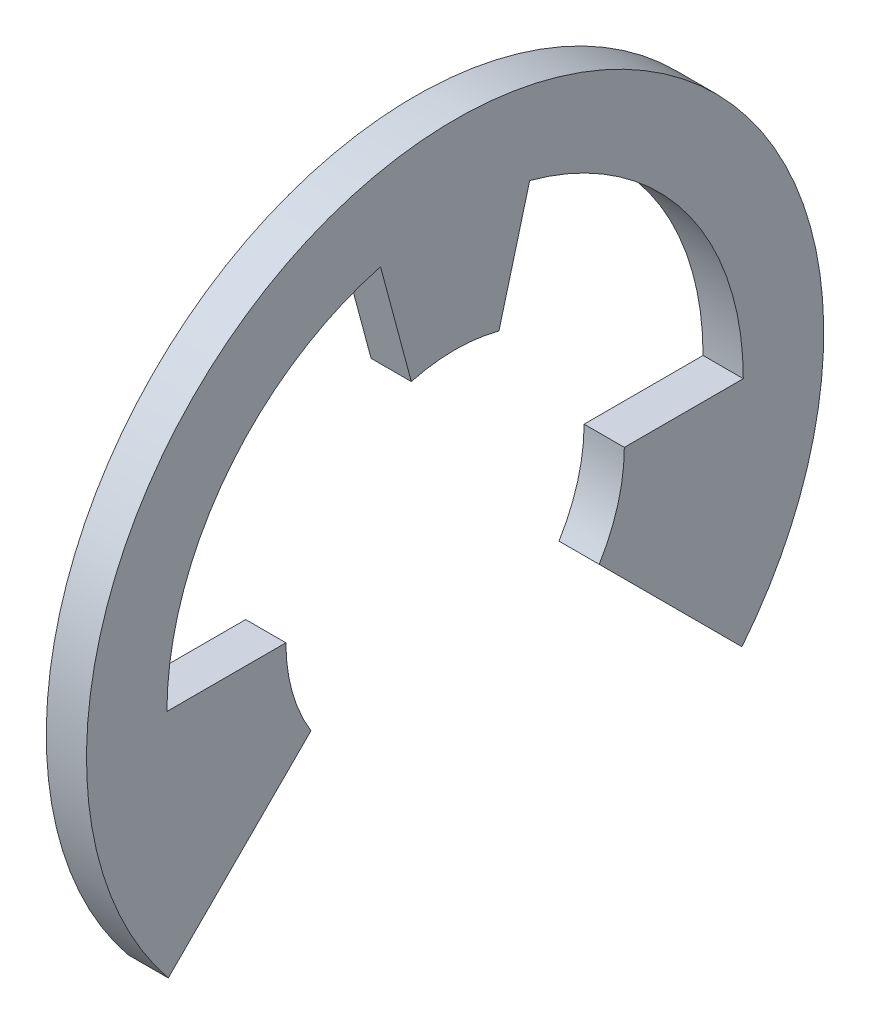
ISO-10303-21;
HEADER;
FILE_DESCRIPTION(('STEP AP214'),'2;1');
FILE_NAME('part.step','',(''),(''),'','','');
FILE_SCHEMA(('AUTOMOTIVE_DESIGN { 1 0 10303 214 1 1 1 1 }'));
ENDSEC;
DATA;
#1=APPLICATION_CONTEXT('core data for automotive mechanical design processes');
#2=APPLICATION_PROTOCOL_DEFINITION('international standard','automotive_design',2000,#1);
#3=PRODUCT_CONTEXT('',#1,'mechanical');
#4=PRODUCT('Part','Part','',(#3));
#5=PRODUCT_RELATED_PRODUCT_CATEGORY('part','',(#4));
#6=PRODUCT_DEFINITION_FORMATION('','',#4);
#7=PRODUCT_DEFINITION_CONTEXT('part definition',#1,'design');
#8=PRODUCT_DEFINITION('design','',#6,#7);
#9=PRODUCT_DEFINITION_SHAPE('','',#8);
#10=(LENGTH_UNIT() NAMED_UNIT(*) SI_UNIT(.MILLI.,.METRE.));
#11=(NAMED_UNIT(*) PLANE_ANGLE_UNIT() SI_UNIT($,.RADIAN.));
#12=(NAMED_UNIT(*) SI_UNIT($,.STERADIAN.) SOLID_ANGLE_UNIT());
#13=UNCERTAINTY_MEASURE_WITH_UNIT(LENGTH_MEASURE(1.E-05),#10,'distance_accuracy_value','');
#14=(GEOMETRIC_REPRESENTATION_CONTEXT(3) GLOBAL_UNCERTAINTY_ASSIGNED_CONTEXT((#13)) GLOBAL_UNIT_ASSIGNED_CONTEXT((#10,
#11,#12)) REPRESENTATION_CONTEXT('',''));
#15=CARTESIAN_POINT('',(0.,0.,0.));
#16=DIRECTION('',(0.,0.,1.));
#17=DIRECTION('',(1.,0.,0.));
#18=AXIS2_PLACEMENT_3D('',#15,#16,#17);
#19=CARTESIAN_POINT('',(0.6,0.,0.));
#20=DIRECTION('',(-1.,0.,0.));
#21=DIRECTION('',(0.,0.,1.));
#22=AXIS2_PLACEMENT_3D('',#19,#20,#21);
#23=CYLINDRICAL_SURFACE('',#22,2.525);
#24=CARTESIAN_POINT('',(0.,0.,0.));
#25=DIRECTION('',(-1.,0.,0.));
#26=DIRECTION('',(0.,0.,-1.));
#27=AXIS2_PLACEMENT_3D('',#24,#25,#26);
#28=CIRCLE('',#27,2.525);
#29=CARTESIAN_POINT('',(0.,-1.32405626768654,2.15));
#30=VERTEX_POINT('',#29);
#31=CARTESIAN_POINT('',(0.,0.,2.525));
#32=VERTEX_POINT('',#31);
#33=EDGE_CURVE('E154',#30,#32,#28,.T.);
#34=ORIENTED_EDGE('',*,*,#33,.T.);
#35=DIRECTION('',(-1.,0.,0.));
#36=VECTOR('',#35,1.);
#37=CARTESIAN_POINT('',(0.6,0.,2.525));
#38=LINE('',#37,#36);
#39=CARTESIAN_POINT('',(0.6,0.,2.525));
#40=VERTEX_POINT('',#39);
#41=EDGE_CURVE('E11',#40,#32,#38,.T.);
#42=ORIENTED_EDGE('',*,*,#41,.F.);
#43=CARTESIAN_POINT('',(0.6,0.,0.));
#44=DIRECTION('',(-1.,0.,0.));
#45=DIRECTION('',(0.,0.,-1.));
#46=AXIS2_PLACEMENT_3D('',#43,#44,#45);
#47=CIRCLE('',#46,2.525);
#48=CARTESIAN_POINT('',(0.6,-1.32405626768654,2.15));
#49=VERTEX_POINT('',#48);
#50=EDGE_CURVE('E176',#49,#40,#47,.T.);
#51=ORIENTED_EDGE('',*,*,#50,.F.);
#52=DIRECTION('',(-1.,0.,0.));
#53=VECTOR('',#52,1.);
#54=CARTESIAN_POINT('',(0.6,-1.32405626768654,2.15));
#55=LINE('',#54,#53);
#56=EDGE_CURVE('E150',#49,#30,#55,.T.);
#57=ORIENTED_EDGE('',*,*,#56,.T.);
#58=EDGE_LOOP('',(#34,#42,#51,#57));
#59=FACE_BOUND('',#58,.T.);
#60=ADVANCED_FACE('F34',(#59),#23,.F.);
#61=CARTESIAN_POINT('',(0.6,0.,2.525));
#62=DIRECTION('',(0.,-1.,0.));
#63=DIRECTION('',(0.,0.,-1.));
#64=AXIS2_PLACEMENT_3D('',#61,#62,#63);
#65=PLANE('',#64);
#66=DIRECTION('',(0.,0.,1.));
#67=VECTOR('',#66,1.);
#68=CARTESIAN_POINT('',(0.,0.,2.525));
#69=LINE('',#68,#67);
#70=CARTESIAN_POINT('',(0.,0.,4.3));
#71=VERTEX_POINT('',#70);
#72=EDGE_CURVE('E157',#32,#71,#69,.T.);
#73=ORIENTED_EDGE('',*,*,#72,.T.);
#74=DIRECTION('',(-1.,0.,0.));
#75=VECTOR('',#74,1.);
#76=CARTESIAN_POINT('',(0.6,0.,4.3));
#77=LINE('',#76,#75);
#78=CARTESIAN_POINT('',(0.6,0.,4.3));
#79=VERTEX_POINT('',#78);
#80=EDGE_CURVE('E42',#79,#71,#77,.T.);
#81=ORIENTED_EDGE('',*,*,#80,.F.);
#82=DIRECTION('',(0.,0.,1.));
#83=VECTOR('',#82,1.);
#84=CARTESIAN_POINT('',(0.6,0.,2.525));
#85=LINE('',#84,#83);
#86=EDGE_CURVE('E105',#40,#79,#85,.T.);
#87=ORIENTED_EDGE('',*,*,#86,.F.);
#88=ORIENTED_EDGE('',*,*,#41,.T.);
#89=EDGE_LOOP('',(#73,#81,#87,#88));
#90=FACE_BOUND('',#89,.T.);
#91=ADVANCED_FACE('F254',(#90),#65,.F.);
#92=CARTESIAN_POINT('',(0.6,0.,0.));
#93=DIRECTION('',(-1.,0.,0.));
#94=DIRECTION('',(0.,0.,1.));
#95=AXIS2_PLACEMENT_3D('',#92,#93,#94);
#96=CYLINDRICAL_SURFACE('',#95,4.3);
#97=CARTESIAN_POINT('',(0.,0.,0.));
#98=DIRECTION('',(-1.,0.,0.));
#99=DIRECTION('',(0.,0.,-1.));
#100=AXIS2_PLACEMENT_3D('',#97,#98,#99);
#101=CIRCLE('',#100,4.3);
#102=CARTESIAN_POINT('',(0.,4.15348105304298,1.11292189394089));
#103=VERTEX_POINT('',#102);
#104=EDGE_CURVE('E159',#71,#103,#101,.T.);
#105=ORIENTED_EDGE('',*,*,#104,.T.);
#106=DIRECTION('',(-1.,0.,0.));
#107=VECTOR('',#106,1.);
#108=CARTESIAN_POINT('',(0.6,4.15348105304298,1.11292189394089));
#109=LINE('',#108,#107);
#110=CARTESIAN_POINT('',(0.6,4.15348105304298,1.11292189394089));
#111=VERTEX_POINT('',#110);
#112=EDGE_CURVE('E195',#111,#103,#109,.T.);
#113=ORIENTED_EDGE('',*,*,#112,.F.);
#114=CARTESIAN_POINT('',(0.6,0.,0.));
#115=DIRECTION('',(-1.,0.,0.));
#116=DIRECTION('',(0.,0.,-1.));
#117=AXIS2_PLACEMENT_3D('',#114,#115,#116);
#118=CIRCLE('',#117,4.3);
#119=EDGE_CURVE('E203',#79,#111,#118,.T.);
#120=ORIENTED_EDGE('',*,*,#119,.F.);
#121=ORIENTED_EDGE('',*,*,#80,.T.);
#122=EDGE_LOOP('',(#105,#113,#120,#121));
#123=FACE_BOUND('',#122,.T.);
#124=ADVANCED_FACE('F201',(#123),#96,.F.);
#125=CARTESIAN_POINT('',(0.6,2.43896271137989,0.653518088883895));
#126=DIRECTION('',(0.,0.258819045102533,-0.965925826289065));
#127=DIRECTION('',(0.,0.965925826289065,0.258819045102533));
#128=AXIS2_PLACEMENT_3D('',#125,#126,#127);
#129=PLANE('',#128);
#130=DIRECTION('',(0.,-0.965925826289065,-0.258819045102533));
#131=VECTOR('',#130,1.);
#132=CARTESIAN_POINT('',(0.,2.43896271137989,0.653518088883895));
#133=LINE('',#132,#131);
#134=CARTESIAN_POINT('',(0.,2.43896271137989,0.653518088883895));
#135=VERTEX_POINT('',#134);
#136=EDGE_CURVE('E161',#103,#135,#133,.T.);
#137=ORIENTED_EDGE('',*,*,#136,.T.);
#138=DIRECTION('',(-1.,0.,0.));
#139=VECTOR('',#138,1.);
#140=CARTESIAN_POINT('',(0.6,2.43896271137989,0.653518088883895));
#141=LINE('',#140,#139);
#142=CARTESIAN_POINT('',(0.6,2.43896271137989,0.653518088883895));
#143=VERTEX_POINT('',#142);
#144=EDGE_CURVE('E192',#143,#135,#141,.T.);
#145=ORIENTED_EDGE('',*,*,#144,.F.);
#146=DIRECTION('',(0.,-0.965925826289065,-0.258819045102533));
#147=VECTOR('',#146,1.);
#148=CARTESIAN_POINT('',(0.6,2.43896271137989,0.653518088883895));
#149=LINE('',#148,#147);
#150=EDGE_CURVE('E221',#111,#143,#149,.T.);
#151=ORIENTED_EDGE('',*,*,#150,.F.);
#152=ORIENTED_EDGE('',*,*,#112,.T.);
#153=EDGE_LOOP('',(#137,#145,#151,#152));
#154=FACE_BOUND('',#153,.T.);
#155=ADVANCED_FACE('F212',(#154),#129,.F.);
#156=CARTESIAN_POINT('',(0.6,0.,0.));
#157=DIRECTION('',(-1.,0.,0.));
#158=DIRECTION('',(0.,0.,1.));
#159=AXIS2_PLACEMENT_3D('',#156,#157,#158);
#160=CYLINDRICAL_SURFACE('',#159,2.525);
#161=CARTESIAN_POINT('',(0.,0.,0.));
#162=DIRECTION('',(-1.,0.,0.));
#163=DIRECTION('',(0.,0.,-1.));
#164=AXIS2_PLACEMENT_3D('',#161,#162,#163);
#165=CIRCLE('',#164,2.525);
#166=CARTESIAN_POINT('',(0.,2.43896271137989,-0.653518088883895));
#167=VERTEX_POINT('',#166);
#168=EDGE_CURVE('E163',#135,#167,#165,.T.);
#169=ORIENTED_EDGE('',*,*,#168,.T.);
#170=DIRECTION('',(-1.,0.,0.));
#171=VECTOR('',#170,1.);
#172=CARTESIAN_POINT('',(0.6,2.43896271137989,-0.653518088883895));
#173=LINE('',#172,#171);
#174=CARTESIAN_POINT('',(0.6,2.43896271137989,-0.653518088883895));
#175=VERTEX_POINT('',#174);
#176=EDGE_CURVE('E189',#175,#167,#173,.T.);
#177=ORIENTED_EDGE('',*,*,#176,.F.);
#178=CARTESIAN_POINT('',(0.6,0.,0.));
#179=DIRECTION('',(-1.,0.,0.));
#180=DIRECTION('',(0.,0.,-1.));
#181=AXIS2_PLACEMENT_3D('',#178,#179,#180);
#182=CIRCLE('',#181,2.525);
#183=EDGE_CURVE('E218',#143,#175,#182,.T.);
#184=ORIENTED_EDGE('',*,*,#183,.F.);
#185=ORIENTED_EDGE('',*,*,#144,.T.);
#186=EDGE_LOOP('',(#169,#177,#184,#185));
#187=FACE_BOUND('',#186,.T.);
#188=ADVANCED_FACE('F216',(#187),#160,.F.);
#189=CARTESIAN_POINT('',(0.6,4.15348105304298,-1.11292189394089));
#190=DIRECTION('',(0.,0.258819045102533,0.965925826289065));
#191=DIRECTION('',(0.,-0.965925826289065,0.258819045102533));
#192=AXIS2_PLACEMENT_3D('',#189,#190,#191);
#193=PLANE('',#192);
#194=DIRECTION('',(0.,0.965925826289065,-0.258819045102533));
#195=VECTOR('',#194,1.);
#196=CARTESIAN_POINT('',(0.,4.15348105304298,-1.11292189394089));
#197=LINE('',#196,#195);
#198=CARTESIAN_POINT('',(0.,4.15348105304298,-1.11292189394089));
#199=VERTEX_POINT('',#198);
#200=EDGE_CURVE('E165',#167,#199,#197,.T.);
#201=ORIENTED_EDGE('',*,*,#200,.T.);
#202=DIRECTION('',(-1.,0.,0.));
#203=VECTOR('',#202,1.);
#204=CARTESIAN_POINT('',(0.6,4.15348105304298,-1.11292189394089));
#205=LINE('',#204,#203);
#206=CARTESIAN_POINT('',(0.6,4.15348105304298,-1.11292189394089));
#207=VERTEX_POINT('',#206);
#208=EDGE_CURVE('E186',#207,#199,#205,.T.);
#209=ORIENTED_EDGE('',*,*,#208,.F.);
#210=DIRECTION('',(0.,0.965925826289065,-0.258819045102533));
#211=VECTOR('',#210,1.);
#212=CARTESIAN_POINT('',(0.6,4.15348105304298,-1.11292189394089));
#213=LINE('',#212,#211);
#214=EDGE_CURVE('E220',#175,#207,#213,.T.);
#215=ORIENTED_EDGE('',*,*,#214,.F.);
#216=ORIENTED_EDGE('',*,*,#176,.T.);
#217=EDGE_LOOP('',(#201,#209,#215,#216));
#218=FACE_BOUND('',#217,.T.);
#219=ADVANCED_FACE('F267',(#218),#193,.F.);
#220=CARTESIAN_POINT('',(0.6,0.,0.));
#221=DIRECTION('',(-1.,0.,0.));
#222=DIRECTION('',(0.,0.,1.));
#223=AXIS2_PLACEMENT_3D('',#220,#221,#222);
#224=CYLINDRICAL_SURFACE('',#223,4.3);
#225=CARTESIAN_POINT('',(0.,0.,0.));
#226=DIRECTION('',(-1.,0.,0.));
#227=DIRECTION('',(0.,0.,-1.));
#228=AXIS2_PLACEMENT_3D('',#225,#226,#227);
#229=CIRCLE('',#228,4.3);
#230=CARTESIAN_POINT('',(0.,0.,-4.3));
#231=VERTEX_POINT('',#230);
#232=EDGE_CURVE('E167',#199,#231,#229,.T.);
#233=ORIENTED_EDGE('',*,*,#232,.T.);
#234=DIRECTION('',(-1.,0.,0.));
#235=VECTOR('',#234,1.);
#236=CARTESIAN_POINT('',(0.6,0.,-4.3));
#237=LINE('',#236,#235);
#238=CARTESIAN_POINT('',(0.6,0.,-4.3));
#239=VERTEX_POINT('',#238);
#240=EDGE_CURVE('E183',#239,#231,#237,.T.);
#241=ORIENTED_EDGE('',*,*,#240,.F.);
#242=CARTESIAN_POINT('',(0.6,0.,0.));
#243=DIRECTION('',(-1.,0.,0.));
#244=DIRECTION('',(0.,0.,-1.));
#245=AXIS2_PLACEMENT_3D('',#242,#243,#244);
#246=CIRCLE('',#245,4.3);
#247=EDGE_CURVE('E223',#207,#239,#246,.T.);
#248=ORIENTED_EDGE('',*,*,#247,.F.);
#249=ORIENTED_EDGE('',*,*,#208,.T.);
#250=EDGE_LOOP('',(#233,#241,#248,#249));
#251=FACE_BOUND('',#250,.T.);
#252=ADVANCED_FACE('F270',(#251),#224,.F.);
#253=CARTESIAN_POINT('',(0.6,0.,-2.525));
#254=DIRECTION('',(0.,-1.,0.));
#255=DIRECTION('',(0.,0.,-1.));
#256=AXIS2_PLACEMENT_3D('',#253,#254,#255);
#257=PLANE('',#256);
#258=DIRECTION('',(0.,0.,1.));
#259=VECTOR('',#258,1.);
#260=CARTESIAN_POINT('',(0.,0.,-2.525));
#261=LINE('',#260,#259);
#262=CARTESIAN_POINT('',(0.,0.,-2.525));
#263=VERTEX_POINT('',#262);
#264=EDGE_CURVE('E169',#231,#263,#261,.T.);
#265=ORIENTED_EDGE('',*,*,#264,.T.);
#266=DIRECTION('',(-1.,0.,0.));
#267=VECTOR('',#266,1.);
#268=CARTESIAN_POINT('',(0.6,0.,-2.525));
#269=LINE('',#268,#267);
#270=CARTESIAN_POINT('',(0.6,0.,-2.525));
#271=VERTEX_POINT('',#270);
#272=EDGE_CURVE('E180',#271,#263,#269,.T.);
#273=ORIENTED_EDGE('',*,*,#272,.F.);
#274=DIRECTION('',(0.,0.,1.));
#275=VECTOR('',#274,1.);
#276=CARTESIAN_POINT('',(0.6,0.,-2.525));
#277=LINE('',#276,#275);
#278=EDGE_CURVE('E229',#239,#271,#277,.T.);
#279=ORIENTED_EDGE('',*,*,#278,.F.);
#280=ORIENTED_EDGE('',*,*,#240,.T.);
#281=EDGE_LOOP('',(#265,#273,#279,#280));
#282=FACE_BOUND('',#281,.T.);
#283=ADVANCED_FACE('F235',(#282),#257,.F.);
#284=CARTESIAN_POINT('',(0.6,0.,0.));
#285=DIRECTION('',(-1.,0.,0.));
#286=DIRECTION('',(0.,0.,1.));
#287=AXIS2_PLACEMENT_3D('',#284,#285,#286);
#288=CYLINDRICAL_SURFACE('',#287,2.525);
#289=CARTESIAN_POINT('',(0.,0.,0.));
#290=DIRECTION('',(-1.,0.,0.));
#291=DIRECTION('',(0.,0.,-1.));
#292=AXIS2_PLACEMENT_3D('',#289,#290,#291);
#293=CIRCLE('',#292,2.525);
#294=CARTESIAN_POINT('',(0.,-1.32405626768654,-2.15));
#295=VERTEX_POINT('',#294);
#296=EDGE_CURVE('E171',#263,#295,#293,.T.);
#297=ORIENTED_EDGE('',*,*,#296,.T.);
#298=DIRECTION('',(-1.,0.,0.));
#299=VECTOR('',#298,1.);
#300=CARTESIAN_POINT('',(0.6,-1.32405626768654,-2.15));
#301=LINE('',#300,#299);
#302=CARTESIAN_POINT('',(0.6,-1.32405626768654,-2.15));
#303=VERTEX_POINT('',#302);
#304=EDGE_CURVE('E145',#303,#295,#301,.T.);
#305=ORIENTED_EDGE('',*,*,#304,.F.);
#306=CARTESIAN_POINT('',(0.6,0.,0.));
#307=DIRECTION('',(-1.,0.,0.));
#308=DIRECTION('',(0.,0.,-1.));
#309=AXIS2_PLACEMENT_3D('',#306,#307,#308);
#310=CIRCLE('',#309,2.525);
#311=EDGE_CURVE('E136',#271,#303,#310,.T.);
#312=ORIENTED_EDGE('',*,*,#311,.F.);
#313=ORIENTED_EDGE('',*,*,#272,.T.);
#314=EDGE_LOOP('',(#297,#305,#312,#313));
#315=FACE_BOUND('',#314,.T.);
#316=ADVANCED_FACE('F239',(#315),#288,.F.);
#317=CARTESIAN_POINT('',(0.6,-1.32405626768654,-2.15));
#318=DIRECTION('',(0.,0.707106781186547,-0.707106781186548));
#319=DIRECTION('',(0.,0.707106781186548,0.707106781186547));
#320=AXIS2_PLACEMENT_3D('',#317,#318,#319);
#321=PLANE('',#320);
#322=DIRECTION('',(0.,-0.707106781186548,-0.707106781186547));
#323=VECTOR('',#322,1.);
#324=CARTESIAN_POINT('',(0.,-1.32405626768654,-2.15));
#325=LINE('',#324,#323);
#326=CARTESIAN_POINT('',(0.,-3.45412707720676,-4.28007080952022));
#327=VERTEX_POINT('',#326);
#328=EDGE_CURVE('E144',#295,#327,#325,.T.);
#329=ORIENTED_EDGE('',*,*,#328,.T.);
#330=DIRECTION('',(-1.,0.,0.));
#331=VECTOR('',#330,1.);
#332=CARTESIAN_POINT('',(0.6,-3.45412707720676,-4.28007080952022));
#333=LINE('',#332,#331);
#334=CARTESIAN_POINT('',(0.6,-3.45412707720676,-4.28007080952022));
#335=VERTEX_POINT('',#334);
#336=EDGE_CURVE('E141',#335,#327,#333,.T.);
#337=ORIENTED_EDGE('',*,*,#336,.F.);
#338=DIRECTION('',(0.,-0.707106781186548,-0.707106781186547));
#339=VECTOR('',#338,1.);
#340=CARTESIAN_POINT('',(0.6,-1.32405626768654,-2.15));
#341=LINE('',#340,#339);
#342=EDGE_CURVE('E130',#303,#335,#341,.T.);
#343=ORIENTED_EDGE('',*,*,#342,.F.);
#344=ORIENTED_EDGE('',*,*,#304,.T.);
#345=EDGE_LOOP('',(#329,#337,#343,#344));
#346=FACE_BOUND('',#345,.T.);
#347=ADVANCED_FACE('F142',(#346),#321,.F.);
#348=CARTESIAN_POINT('',(0.6,0.,0.));
#349=DIRECTION('',(-1.,0.,0.));
#350=DIRECTION('',(0.,0.,1.));
#351=AXIS2_PLACEMENT_3D('',#348,#349,#350);
#352=CYLINDRICAL_SURFACE('',#351,5.5);
#353=CARTESIAN_POINT('',(0.,0.,0.));
#354=DIRECTION('',(1.,0.,0.));
#355=DIRECTION('',(0.,0.,-1.));
#356=AXIS2_PLACEMENT_3D('',#353,#354,#355);
#357=CIRCLE('',#356,5.5);
#358=CARTESIAN_POINT('',(0.,-3.45412707720676,4.28007080952022));
#359=VERTEX_POINT('',#358);
#360=EDGE_CURVE('E91',#327,#359,#357,.T.);
#361=ORIENTED_EDGE('',*,*,#360,.T.);
#362=DIRECTION('',(-1.,0.,0.));
#363=VECTOR('',#362,1.);
#364=CARTESIAN_POINT('',(0.6,-3.45412707720676,4.28007080952022));
#365=LINE('',#364,#363);
#366=CARTESIAN_POINT('',(0.6,-3.45412707720676,4.28007080952022));
#367=VERTEX_POINT('',#366);
#368=EDGE_CURVE('E146',#367,#359,#365,.T.);
#369=ORIENTED_EDGE('',*,*,#368,.F.);
#370=CARTESIAN_POINT('',(0.6,0.,0.));
#371=DIRECTION('',(1.,0.,0.));
#372=DIRECTION('',(0.,0.,-1.));
#373=AXIS2_PLACEMENT_3D('',#370,#371,#372);
#374=CIRCLE('',#373,5.5);
#375=EDGE_CURVE('E134',#335,#367,#374,.T.);
#376=ORIENTED_EDGE('',*,*,#375,.F.);
#377=ORIENTED_EDGE('',*,*,#336,.T.);
#378=EDGE_LOOP('',(#361,#369,#376,#377));
#379=FACE_BOUND('',#378,.T.);
#380=ADVANCED_FACE('F148',(#379),#352,.T.);
#381=CARTESIAN_POINT('',(0.6,-1.32405626768654,2.15));
#382=DIRECTION('',(0.,0.707106781186547,0.707106781186548));
#383=DIRECTION('',(0.,-0.707106781186548,0.707106781186547));
#384=AXIS2_PLACEMENT_3D('',#381,#382,#383);
#385=PLANE('',#384);
#386=DIRECTION('',(0.,0.707106781186548,-0.707106781186547));
#387=VECTOR('',#386,1.);
#388=CARTESIAN_POINT('',(0.,-1.32405626768654,2.15));
#389=LINE('',#388,#387);
#390=EDGE_CURVE('E97',#359,#30,#389,.T.);
#391=ORIENTED_EDGE('',*,*,#390,.T.);
#392=ORIENTED_EDGE('',*,*,#56,.F.);
#393=DIRECTION('',(0.,0.707106781186548,-0.707106781186547));
#394=VECTOR('',#393,1.);
#395=CARTESIAN_POINT('',(0.6,-1.32405626768654,2.15));
#396=LINE('',#395,#394);
#397=EDGE_CURVE('E50',#367,#49,#396,.T.);
#398=ORIENTED_EDGE('',*,*,#397,.F.);
#399=ORIENTED_EDGE('',*,*,#368,.T.);
#400=EDGE_LOOP('',(#391,#392,#398,#399));
#401=FACE_BOUND('',#400,.T.);
#402=ADVANCED_FACE('F243',(#401),#385,.F.);
#403=CARTESIAN_POINT('',(0.6,0.,0.));
#404=DIRECTION('',(1.,0.,0.));
#405=DIRECTION('',(0.,0.,-1.));
#406=AXIS2_PLACEMENT_3D('',#403,#404,#405);
#407=PLANE('',#406);
#408=ORIENTED_EDGE('',*,*,#50,.T.);
#409=ORIENTED_EDGE('',*,*,#86,.T.);
#410=ORIENTED_EDGE('',*,*,#119,.T.);
#411=ORIENTED_EDGE('',*,*,#150,.T.);
#412=ORIENTED_EDGE('',*,*,#183,.T.);
#413=ORIENTED_EDGE('',*,*,#214,.T.);
#414=ORIENTED_EDGE('',*,*,#247,.T.);
#415=ORIENTED_EDGE('',*,*,#278,.T.);
#416=ORIENTED_EDGE('',*,*,#311,.T.);
#417=ORIENTED_EDGE('',*,*,#342,.T.);
#418=ORIENTED_EDGE('',*,*,#375,.T.);
#419=ORIENTED_EDGE('',*,*,#397,.T.);
#420=EDGE_LOOP('',(#408,#409,#410,#411,#412,#413,#414,#415,#416,#417,#418,#419));
#421=FACE_BOUND('',#420,.T.);
#422=ADVANCED_FACE('F132',(#421),#407,.T.);
#423=CARTESIAN_POINT('',(0.,0.,0.));
#424=DIRECTION('',(1.,0.,0.));
#425=DIRECTION('',(0.,0.,-1.));
#426=AXIS2_PLACEMENT_3D('',#423,#424,#425);
#427=PLANE('',#426);
#428=ORIENTED_EDGE('',*,*,#33,.F.);
#429=ORIENTED_EDGE('',*,*,#390,.F.);
#430=ORIENTED_EDGE('',*,*,#360,.F.);
#431=ORIENTED_EDGE('',*,*,#328,.F.);
#432=ORIENTED_EDGE('',*,*,#296,.F.);
#433=ORIENTED_EDGE('',*,*,#264,.F.);
#434=ORIENTED_EDGE('',*,*,#232,.F.);
#435=ORIENTED_EDGE('',*,*,#200,.F.);
#436=ORIENTED_EDGE('',*,*,#168,.F.);
#437=ORIENTED_EDGE('',*,*,#136,.F.);
#438=ORIENTED_EDGE('',*,*,#104,.F.);
#439=ORIENTED_EDGE('',*,*,#72,.F.);
#440=EDGE_LOOP('',(#428,#429,#430,#431,#432,#433,#434,#435,#436,#437,#438,#439));
#441=FACE_BOUND('',#440,.T.);
#442=ADVANCED_FACE('F207',(#441),#427,.F.);
#443=CLOSED_SHELL('',(#60,#91,#124,#155,#188,#219,#252,#283,#316,#347,#380,#402,#422,#442));
#444=MANIFOLD_SOLID_BREP('B2',#443);
#445=ADVANCED_BREP_SHAPE_REPRESENTATION('',(#18,#444),#14);
#446=SHAPE_DEFINITION_REPRESENTATION(#9,#445);
ENDSEC;
END-ISO-10303-21;
